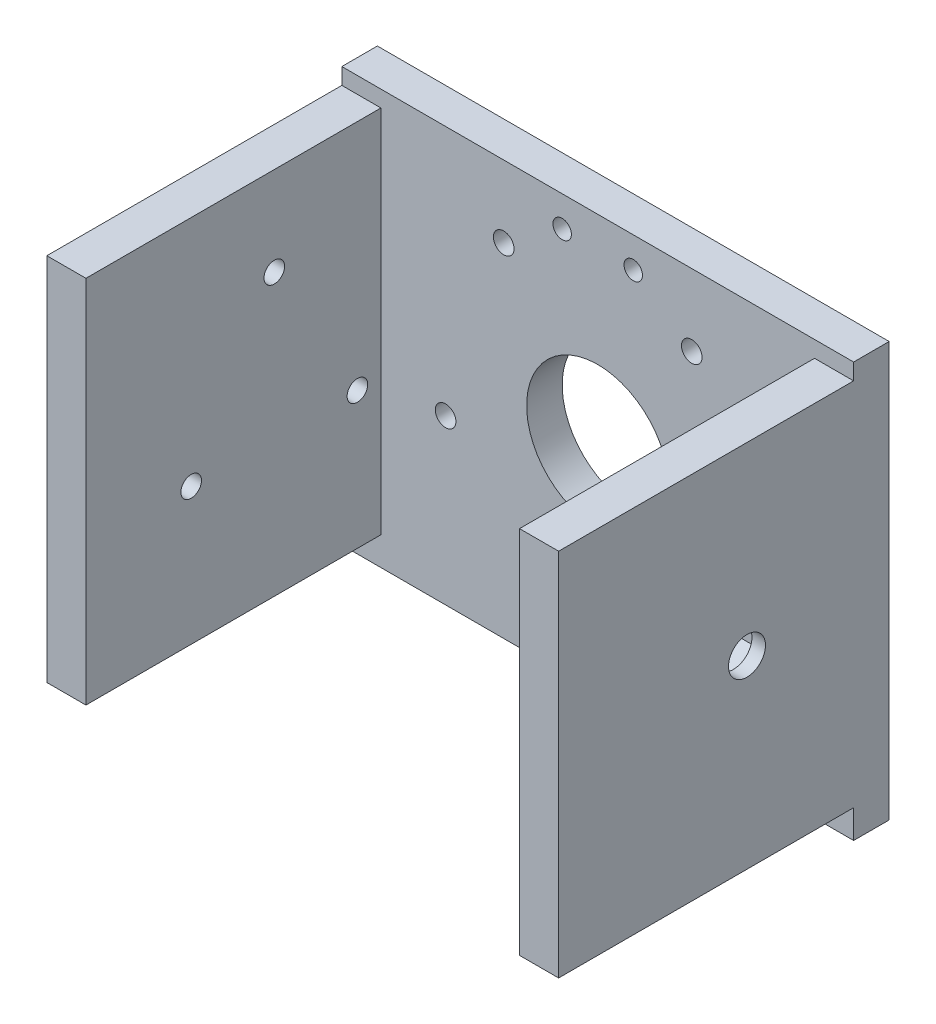
ISO-10303-21;
HEADER;
FILE_DESCRIPTION(('STEP AP214'),'2;1');
FILE_NAME('part.step','',(''),(''),'','','');
FILE_SCHEMA(('AUTOMOTIVE_DESIGN { 1 0 10303 214 1 1 1 1 }'));
ENDSEC;
DATA;
#1=APPLICATION_CONTEXT('core data for automotive mechanical design processes');
#2=APPLICATION_PROTOCOL_DEFINITION('international standard','automotive_design',2000,#1);
#3=PRODUCT_CONTEXT('',#1,'mechanical');
#4=PRODUCT('Part','Part','',(#3));
#5=PRODUCT_RELATED_PRODUCT_CATEGORY('part','',(#4));
#6=PRODUCT_DEFINITION_FORMATION('','',#4);
#7=PRODUCT_DEFINITION_CONTEXT('part definition',#1,'design');
#8=PRODUCT_DEFINITION('design','',#6,#7);
#9=PRODUCT_DEFINITION_SHAPE('','',#8);
#10=(LENGTH_UNIT() NAMED_UNIT(*) SI_UNIT(.MILLI.,.METRE.));
#11=(NAMED_UNIT(*) PLANE_ANGLE_UNIT() SI_UNIT($,.RADIAN.));
#12=(NAMED_UNIT(*) SI_UNIT($,.STERADIAN.) SOLID_ANGLE_UNIT());
#13=UNCERTAINTY_MEASURE_WITH_UNIT(LENGTH_MEASURE(1.E-05),#10,'distance_accuracy_value','');
#14=(GEOMETRIC_REPRESENTATION_CONTEXT(3) GLOBAL_UNCERTAINTY_ASSIGNED_CONTEXT((#13)) GLOBAL_UNIT_ASSIGNED_CONTEXT((#10,
#11,#12)) REPRESENTATION_CONTEXT('',''));
#15=CARTESIAN_POINT('',(0.,0.,0.));
#16=DIRECTION('',(0.,0.,1.));
#17=DIRECTION('',(1.,0.,0.));
#18=AXIS2_PLACEMENT_3D('',#15,#16,#17);
#19=CARTESIAN_POINT('',(330.5,0.,0.));
#20=DIRECTION('',(-1.,0.,0.));
#21=DIRECTION('',(0.,0.,1.));
#22=AXIS2_PLACEMENT_3D('',#19,#20,#21);
#23=PLANE('',#22);
#24=DIRECTION('',(0.,0.,1.));
#25=VECTOR('',#24,1.);
#26=CARTESIAN_POINT('',(330.5,326.,326.5));
#27=LINE('',#26,#25);
#28=CARTESIAN_POINT('',(330.5,326.,285.));
#29=VERTEX_POINT('',#28);
#30=CARTESIAN_POINT('',(330.5,326.,326.5));
#31=VERTEX_POINT('',#30);
#32=EDGE_CURVE('E197',#29,#31,#27,.T.);
#33=ORIENTED_EDGE('',*,*,#32,.F.);
#34=DIRECTION('',(0.,-1.,0.));
#35=VECTOR('',#34,1.);
#36=CARTESIAN_POINT('',(330.5,0.,285.));
#37=LINE('',#36,#35);
#38=CARTESIAN_POINT('',(330.5,274.,285.));
#39=VERTEX_POINT('',#38);
#40=EDGE_CURVE('E220',#29,#39,#37,.T.);
#41=ORIENTED_EDGE('',*,*,#40,.T.);
#42=DIRECTION('',(0.,0.,-1.));
#43=VECTOR('',#42,1.);
#44=CARTESIAN_POINT('',(330.5,274.,280.));
#45=LINE('',#44,#43);
#46=CARTESIAN_POINT('',(330.5,274.,326.5));
#47=VERTEX_POINT('',#46);
#48=EDGE_CURVE('E63',#47,#39,#45,.T.);
#49=ORIENTED_EDGE('',*,*,#48,.F.);
#50=DIRECTION('',(0.,-1.,0.));
#51=VECTOR('',#50,1.);
#52=CARTESIAN_POINT('',(330.5,274.,326.5));
#53=LINE('',#52,#51);
#54=EDGE_CURVE('E207',#31,#47,#53,.T.);
#55=ORIENTED_EDGE('',*,*,#54,.F.);
#56=EDGE_LOOP('',(#33,#41,#49,#55));
#57=FACE_BOUND('',#56,.T.);
#58=DIRECTION('',(0.,-0.499999999999993,0.866025403784443));
#59=VECTOR('',#58,1.);
#60=CARTESIAN_POINT('',(330.5,302.367136103677,304.1));
#61=LINE('',#60,#59);
#62=CARTESIAN_POINT('',(330.5,304.734272207355,300.));
#63=VERTEX_POINT('',#62);
#64=CARTESIAN_POINT('',(330.5,302.367136103678,304.1));
#65=VERTEX_POINT('',#64);
#66=EDGE_CURVE('E182',#63,#65,#61,.T.);
#67=ORIENTED_EDGE('',*,*,#66,.T.);
#68=DIRECTION('',(0.,-1.,0.));
#69=VECTOR('',#68,1.);
#70=CARTESIAN_POINT('',(330.5,297.632863896323,304.1));
#71=LINE('',#70,#69);
#72=CARTESIAN_POINT('',(330.5,297.632863896323,304.1));
#73=VERTEX_POINT('',#72);
#74=EDGE_CURVE('E55',#65,#73,#71,.T.);
#75=ORIENTED_EDGE('',*,*,#74,.T.);
#76=DIRECTION('',(0.,-0.499999999999993,-0.866025403784443));
#77=VECTOR('',#76,1.);
#78=CARTESIAN_POINT('',(330.5,295.265727792645,300.));
#79=LINE('',#78,#77);
#80=CARTESIAN_POINT('',(330.5,295.265727792645,300.));
#81=VERTEX_POINT('',#80);
#82=EDGE_CURVE('E186',#73,#81,#79,.T.);
#83=ORIENTED_EDGE('',*,*,#82,.T.);
#84=DIRECTION('',(0.,0.499999999999998,-0.86602540378444));
#85=VECTOR('',#84,1.);
#86=CARTESIAN_POINT('',(330.5,297.632863896323,295.9));
#87=LINE('',#86,#85);
#88=CARTESIAN_POINT('',(330.5,297.632863896323,295.9));
#89=VERTEX_POINT('',#88);
#90=EDGE_CURVE('E643',#81,#89,#87,.T.);
#91=ORIENTED_EDGE('',*,*,#90,.T.);
#92=DIRECTION('',(0.,1.,0.));
#93=VECTOR('',#92,1.);
#94=CARTESIAN_POINT('',(330.5,302.367136103677,295.9));
#95=LINE('',#94,#93);
#96=CARTESIAN_POINT('',(330.5,302.367136103677,295.9));
#97=VERTEX_POINT('',#96);
#98=EDGE_CURVE('E640',#89,#97,#95,.T.);
#99=ORIENTED_EDGE('',*,*,#98,.T.);
#100=DIRECTION('',(0.,0.499999999999998,0.86602540378444));
#101=VECTOR('',#100,1.);
#102=CARTESIAN_POINT('',(330.5,304.734272207355,300.));
#103=LINE('',#102,#101);
#104=EDGE_CURVE('E634',#97,#63,#103,.T.);
#105=ORIENTED_EDGE('',*,*,#104,.T.);
#106=EDGE_LOOP('',(#67,#75,#83,#91,#99,#105));
#107=FACE_BOUND('',#106,.T.);
#108=ADVANCED_FACE('F39',(#57,#107),#23,.T.);
#109=CARTESIAN_POINT('',(336.,300.,300.));
#110=DIRECTION('',(-1.,0.,0.));
#111=DIRECTION('',(0.,0.,1.));
#112=AXIS2_PLACEMENT_3D('',#109,#110,#111);
#113=CYLINDRICAL_SURFACE('',#112,2.59999999999999);
#114=CARTESIAN_POINT('',(336.,300.,300.));
#115=DIRECTION('',(1.,0.,0.));
#116=DIRECTION('',(0.,0.,-1.));
#117=AXIS2_PLACEMENT_3D('',#114,#115,#116);
#118=CIRCLE('',#117,2.59999999999999);
#119=CARTESIAN_POINT('',(336.,300.,297.4));
#120=VERTEX_POINT('',#119);
#121=EDGE_CURVE('E190',#120,#120,#118,.T.);
#122=ORIENTED_EDGE('',*,*,#121,.T.);
#123=EDGE_LOOP('',(#122));
#124=FACE_BOUND('',#123,.T.);
#125=CARTESIAN_POINT('',(334.1,300.,300.));
#126=DIRECTION('',(-1.,0.,0.));
#127=DIRECTION('',(0.,0.,1.));
#128=AXIS2_PLACEMENT_3D('',#125,#126,#127);
#129=CIRCLE('',#128,2.59999999999999);
#130=CARTESIAN_POINT('',(334.1,300.,302.6));
#131=VERTEX_POINT('',#130);
#132=EDGE_CURVE('E43',#131,#131,#129,.T.);
#133=ORIENTED_EDGE('',*,*,#132,.T.);
#134=EDGE_LOOP('',(#133));
#135=FACE_BOUND('',#134,.T.);
#136=ADVANCED_FACE('F416',(#124,#135),#113,.F.);
#137=CARTESIAN_POINT('',(0.,0.,285.));
#138=DIRECTION('',(0.,0.,1.));
#139=DIRECTION('',(1.,0.,0.));
#140=AXIS2_PLACEMENT_3D('',#137,#138,#139);
#141=PLANE('',#140);
#142=CARTESIAN_POINT('',(295.,324.,285.));
#143=DIRECTION('',(0.,0.,1.));
#144=DIRECTION('',(1.,0.,0.));
#145=AXIS2_PLACEMENT_3D('',#142,#143,#144);
#146=CIRCLE('',#145,1.30000000000002);
#147=CARTESIAN_POINT('',(296.3,324.,285.));
#148=VERTEX_POINT('',#147);
#149=EDGE_CURVE('E281',#148,#148,#146,.T.);
#150=ORIENTED_EDGE('',*,*,#149,.F.);
#151=EDGE_LOOP('',(#150));
#152=FACE_BOUND('',#151,.T.);
#153=CARTESIAN_POINT('',(321.398771616641,293.047117626564,285.));
#154=DIRECTION('',(0.,0.,1.));
#155=DIRECTION('',(1.,0.,0.));
#156=AXIS2_PLACEMENT_3D('',#153,#154,#155);
#157=CIRCLE('',#156,1.45000000000001);
#158=CARTESIAN_POINT('',(322.848771616641,293.047117626564,285.));
#159=VERTEX_POINT('',#158);
#160=EDGE_CURVE('E293',#159,#159,#157,.T.);
#161=ORIENTED_EDGE('',*,*,#160,.F.);
#162=EDGE_LOOP('',(#161));
#163=FACE_BOUND('',#162,.T.);
#164=CARTESIAN_POINT('',(278.601228383359,293.047117626564,285.));
#165=DIRECTION('',(0.,0.,1.));
#166=DIRECTION('',(1.,0.,0.));
#167=AXIS2_PLACEMENT_3D('',#164,#165,#166);
#168=CIRCLE('',#167,1.45000000000001);
#169=CARTESIAN_POINT('',(280.051228383359,293.047117626564,285.));
#170=VERTEX_POINT('',#169);
#171=EDGE_CURVE('E305',#170,#170,#168,.T.);
#172=ORIENTED_EDGE('',*,*,#171,.F.);
#173=EDGE_LOOP('',(#172));
#174=FACE_BOUND('',#173,.T.);
#175=CARTESIAN_POINT('',(300.,300.,285.));
#176=DIRECTION('',(0.,0.,1.));
#177=DIRECTION('',(1.,0.,0.));
#178=AXIS2_PLACEMENT_3D('',#175,#176,#177);
#179=CIRCLE('',#178,10.);
#180=CARTESIAN_POINT('',(310.,300.,285.));
#181=VERTEX_POINT('',#180);
#182=EDGE_CURVE('E317',#181,#181,#179,.T.);
#183=ORIENTED_EDGE('',*,*,#182,.F.);
#184=EDGE_LOOP('',(#183));
#185=FACE_BOUND('',#184,.T.);
#186=CARTESIAN_POINT('',(286.774831823419,318.202882373436,285.));
#187=DIRECTION('',(0.,0.,1.));
#188=DIRECTION('',(1.,0.,0.));
#189=AXIS2_PLACEMENT_3D('',#186,#187,#188);
#190=CIRCLE('',#189,1.45000000000001);
#191=CARTESIAN_POINT('',(288.224831823419,318.202882373436,285.));
#192=VERTEX_POINT('',#191);
#193=EDGE_CURVE('E311',#192,#192,#190,.T.);
#194=ORIENTED_EDGE('',*,*,#193,.F.);
#195=EDGE_LOOP('',(#194));
#196=FACE_BOUND('',#195,.T.);
#197=CARTESIAN_POINT('',(300.,277.5,285.));
#198=DIRECTION('',(0.,0.,1.));
#199=DIRECTION('',(1.,0.,0.));
#200=AXIS2_PLACEMENT_3D('',#197,#198,#199);
#201=CIRCLE('',#200,1.45000000000001);
#202=CARTESIAN_POINT('',(301.45,277.5,285.));
#203=VERTEX_POINT('',#202);
#204=EDGE_CURVE('E299',#203,#203,#201,.T.);
#205=ORIENTED_EDGE('',*,*,#204,.F.);
#206=EDGE_LOOP('',(#205));
#207=FACE_BOUND('',#206,.T.);
#208=CARTESIAN_POINT('',(313.225168176581,318.202882373436,285.));
#209=DIRECTION('',(0.,0.,1.));
#210=DIRECTION('',(1.,0.,0.));
#211=AXIS2_PLACEMENT_3D('',#208,#209,#210);
#212=CIRCLE('',#211,1.45000000000001);
#213=CARTESIAN_POINT('',(314.675168176581,318.202882373436,285.));
#214=VERTEX_POINT('',#213);
#215=EDGE_CURVE('E287',#214,#214,#212,.T.);
#216=ORIENTED_EDGE('',*,*,#215,.F.);
#217=EDGE_LOOP('',(#216));
#218=FACE_BOUND('',#217,.T.);
#219=CARTESIAN_POINT('',(305.,324.,285.));
#220=DIRECTION('',(0.,0.,1.));
#221=DIRECTION('',(1.,0.,0.));
#222=AXIS2_PLACEMENT_3D('',#219,#220,#221);
#223=CIRCLE('',#222,1.30000000000002);
#224=CARTESIAN_POINT('',(306.3,324.,285.));
#225=VERTEX_POINT('',#224);
#226=EDGE_CURVE('E275',#225,#225,#223,.T.);
#227=ORIENTED_EDGE('',*,*,#226,.F.);
#228=EDGE_LOOP('',(#227));
#229=FACE_BOUND('',#228,.T.);
#230=ORIENTED_EDGE('',*,*,#40,.F.);
#231=DIRECTION('',(1.,0.,0.));
#232=VECTOR('',#231,1.);
#233=CARTESIAN_POINT('',(0.,326.,285.));
#234=LINE('',#233,#232);
#235=CARTESIAN_POINT('',(336.,326.,285.));
#236=VERTEX_POINT('',#235);
#237=EDGE_CURVE('E217',#29,#236,#234,.T.);
#238=ORIENTED_EDGE('',*,*,#237,.T.);
#239=DIRECTION('',(0.,1.,0.));
#240=VECTOR('',#239,1.);
#241=CARTESIAN_POINT('',(336.,270.,285.));
#242=LINE('',#241,#240);
#243=CARTESIAN_POINT('',(336.,328.3,285.));
#244=VERTEX_POINT('',#243);
#245=EDGE_CURVE('E329',#236,#244,#242,.T.);
#246=ORIENTED_EDGE('',*,*,#245,.T.);
#247=DIRECTION('',(-1.,0.,0.));
#248=VECTOR('',#247,1.);
#249=CARTESIAN_POINT('',(336.,328.3,285.));
#250=LINE('',#249,#248);
#251=CARTESIAN_POINT('',(264.,328.3,285.));
#252=VERTEX_POINT('',#251);
#253=EDGE_CURVE('E333',#244,#252,#250,.T.);
#254=ORIENTED_EDGE('',*,*,#253,.T.);
#255=DIRECTION('',(0.,-1.,0.));
#256=VECTOR('',#255,1.);
#257=CARTESIAN_POINT('',(264.,328.3,285.));
#258=LINE('',#257,#256);
#259=CARTESIAN_POINT('',(264.,326.,285.));
#260=VERTEX_POINT('',#259);
#261=EDGE_CURVE('E323',#252,#260,#258,.T.);
#262=ORIENTED_EDGE('',*,*,#261,.T.);
#263=DIRECTION('',(1.,0.,0.));
#264=VECTOR('',#263,1.);
#265=CARTESIAN_POINT('',(0.,326.,285.));
#266=LINE('',#265,#264);
#267=CARTESIAN_POINT('',(269.5,326.,285.));
#268=VERTEX_POINT('',#267);
#269=EDGE_CURVE('E268',#260,#268,#266,.T.);
#270=ORIENTED_EDGE('',*,*,#269,.T.);
#271=DIRECTION('',(0.,-1.,0.));
#272=VECTOR('',#271,1.);
#273=CARTESIAN_POINT('',(269.5,0.,285.));
#274=LINE('',#273,#272);
#275=CARTESIAN_POINT('',(269.5,274.,285.));
#276=VERTEX_POINT('',#275);
#277=EDGE_CURVE('E271',#268,#276,#274,.T.);
#278=ORIENTED_EDGE('',*,*,#277,.T.);
#279=DIRECTION('',(-1.,0.,0.));
#280=VECTOR('',#279,1.);
#281=CARTESIAN_POINT('',(0.,274.,285.));
#282=LINE('',#281,#280);
#283=CARTESIAN_POINT('',(264.,274.,285.));
#284=VERTEX_POINT('',#283);
#285=EDGE_CURVE('E265',#276,#284,#282,.T.);
#286=ORIENTED_EDGE('',*,*,#285,.T.);
#287=CARTESIAN_POINT('',(264.,270.,285.));
#288=VERTEX_POINT('',#287);
#289=EDGE_CURVE('E327',#284,#288,#258,.T.);
#290=ORIENTED_EDGE('',*,*,#289,.T.);
#291=DIRECTION('',(1.,0.,0.));
#292=VECTOR('',#291,1.);
#293=CARTESIAN_POINT('',(264.,270.,285.));
#294=LINE('',#293,#292);
#295=CARTESIAN_POINT('',(336.,270.,285.));
#296=VERTEX_POINT('',#295);
#297=EDGE_CURVE('E326',#288,#296,#294,.T.);
#298=ORIENTED_EDGE('',*,*,#297,.T.);
#299=CARTESIAN_POINT('',(336.,274.,285.));
#300=VERTEX_POINT('',#299);
#301=EDGE_CURVE('E330',#296,#300,#242,.T.);
#302=ORIENTED_EDGE('',*,*,#301,.T.);
#303=DIRECTION('',(-1.,0.,0.));
#304=VECTOR('',#303,1.);
#305=CARTESIAN_POINT('',(0.,274.,285.));
#306=LINE('',#305,#304);
#307=EDGE_CURVE('E214',#300,#39,#306,.T.);
#308=ORIENTED_EDGE('',*,*,#307,.T.);
#309=EDGE_LOOP('',(#230,#238,#246,#254,#262,#270,#278,#286,#290,#298,#302,#308));
#310=FACE_BOUND('',#309,.T.);
#311=ADVANCED_FACE('F377',(#152,#163,#174,#185,#196,#207,#218,#229,#310),#141,.T.);
#312=CARTESIAN_POINT('',(0.,0.,280.));
#313=DIRECTION('',(0.,0.,1.));
#314=DIRECTION('',(1.,0.,0.));
#315=AXIS2_PLACEMENT_3D('',#312,#313,#314);
#316=PLANE('',#315);
#317=DIRECTION('',(-1.,0.,0.));
#318=VECTOR('',#317,1.);
#319=CARTESIAN_POINT('',(336.,328.3,280.));
#320=LINE('',#319,#318);
#321=CARTESIAN_POINT('',(336.,328.3,280.));
#322=VERTEX_POINT('',#321);
#323=CARTESIAN_POINT('',(264.,328.3,280.));
#324=VERTEX_POINT('',#323);
#325=EDGE_CURVE('E341',#322,#324,#320,.T.);
#326=ORIENTED_EDGE('',*,*,#325,.F.);
#327=DIRECTION('',(0.,1.,0.));
#328=VECTOR('',#327,1.);
#329=CARTESIAN_POINT('',(336.,270.,280.));
#330=LINE('',#329,#328);
#331=CARTESIAN_POINT('',(336.,270.,280.));
#332=VERTEX_POINT('',#331);
#333=EDGE_CURVE('E339',#332,#322,#330,.T.);
#334=ORIENTED_EDGE('',*,*,#333,.F.);
#335=DIRECTION('',(1.,0.,0.));
#336=VECTOR('',#335,1.);
#337=CARTESIAN_POINT('',(264.,270.,280.));
#338=LINE('',#337,#336);
#339=CARTESIAN_POINT('',(264.,270.,280.));
#340=VERTEX_POINT('',#339);
#341=EDGE_CURVE('E337',#340,#332,#338,.T.);
#342=ORIENTED_EDGE('',*,*,#341,.F.);
#343=DIRECTION('',(0.,-1.,0.));
#344=VECTOR('',#343,1.);
#345=CARTESIAN_POINT('',(264.,328.3,280.));
#346=LINE('',#345,#344);
#347=EDGE_CURVE('E320',#324,#340,#346,.T.);
#348=ORIENTED_EDGE('',*,*,#347,.F.);
#349=EDGE_LOOP('',(#326,#334,#342,#348));
#350=FACE_BOUND('',#349,.T.);
#351=CARTESIAN_POINT('',(300.,300.,280.));
#352=DIRECTION('',(0.,0.,1.));
#353=DIRECTION('',(1.,0.,0.));
#354=AXIS2_PLACEMENT_3D('',#351,#352,#353);
#355=CIRCLE('',#354,10.);
#356=CARTESIAN_POINT('',(310.,300.,280.));
#357=VERTEX_POINT('',#356);
#358=EDGE_CURVE('E314',#357,#357,#355,.T.);
#359=ORIENTED_EDGE('',*,*,#358,.T.);
#360=EDGE_LOOP('',(#359));
#361=FACE_BOUND('',#360,.T.);
#362=CARTESIAN_POINT('',(286.774831823419,318.202882373436,280.));
#363=DIRECTION('',(0.,0.,1.));
#364=DIRECTION('',(1.,0.,0.));
#365=AXIS2_PLACEMENT_3D('',#362,#363,#364);
#366=CIRCLE('',#365,1.45000000000001);
#367=CARTESIAN_POINT('',(288.224831823419,318.202882373436,280.));
#368=VERTEX_POINT('',#367);
#369=EDGE_CURVE('E308',#368,#368,#366,.T.);
#370=ORIENTED_EDGE('',*,*,#369,.T.);
#371=EDGE_LOOP('',(#370));
#372=FACE_BOUND('',#371,.T.);
#373=CARTESIAN_POINT('',(278.601228383359,293.047117626564,280.));
#374=DIRECTION('',(0.,0.,1.));
#375=DIRECTION('',(1.,0.,0.));
#376=AXIS2_PLACEMENT_3D('',#373,#374,#375);
#377=CIRCLE('',#376,1.45000000000001);
#378=CARTESIAN_POINT('',(280.051228383359,293.047117626564,280.));
#379=VERTEX_POINT('',#378);
#380=EDGE_CURVE('E302',#379,#379,#377,.T.);
#381=ORIENTED_EDGE('',*,*,#380,.T.);
#382=EDGE_LOOP('',(#381));
#383=FACE_BOUND('',#382,.T.);
#384=CARTESIAN_POINT('',(300.,277.5,280.));
#385=DIRECTION('',(0.,0.,1.));
#386=DIRECTION('',(1.,0.,0.));
#387=AXIS2_PLACEMENT_3D('',#384,#385,#386);
#388=CIRCLE('',#387,1.45000000000001);
#389=CARTESIAN_POINT('',(301.45,277.5,280.));
#390=VERTEX_POINT('',#389);
#391=EDGE_CURVE('E296',#390,#390,#388,.T.);
#392=ORIENTED_EDGE('',*,*,#391,.T.);
#393=EDGE_LOOP('',(#392));
#394=FACE_BOUND('',#393,.T.);
#395=CARTESIAN_POINT('',(321.398771616641,293.047117626564,280.));
#396=DIRECTION('',(0.,0.,1.));
#397=DIRECTION('',(1.,0.,0.));
#398=AXIS2_PLACEMENT_3D('',#395,#396,#397);
#399=CIRCLE('',#398,1.45000000000001);
#400=CARTESIAN_POINT('',(322.848771616641,293.047117626564,280.));
#401=VERTEX_POINT('',#400);
#402=EDGE_CURVE('E290',#401,#401,#399,.T.);
#403=ORIENTED_EDGE('',*,*,#402,.T.);
#404=EDGE_LOOP('',(#403));
#405=FACE_BOUND('',#404,.T.);
#406=CARTESIAN_POINT('',(313.225168176581,318.202882373436,280.));
#407=DIRECTION('',(0.,0.,1.));
#408=DIRECTION('',(1.,0.,0.));
#409=AXIS2_PLACEMENT_3D('',#406,#407,#408);
#410=CIRCLE('',#409,1.45000000000001);
#411=CARTESIAN_POINT('',(314.675168176581,318.202882373436,280.));
#412=VERTEX_POINT('',#411);
#413=EDGE_CURVE('E284',#412,#412,#410,.T.);
#414=ORIENTED_EDGE('',*,*,#413,.T.);
#415=EDGE_LOOP('',(#414));
#416=FACE_BOUND('',#415,.T.);
#417=CARTESIAN_POINT('',(295.,324.,280.));
#418=DIRECTION('',(0.,0.,1.));
#419=DIRECTION('',(1.,0.,0.));
#420=AXIS2_PLACEMENT_3D('',#417,#418,#419);
#421=CIRCLE('',#420,1.30000000000002);
#422=CARTESIAN_POINT('',(296.3,324.,280.));
#423=VERTEX_POINT('',#422);
#424=EDGE_CURVE('E278',#423,#423,#421,.T.);
#425=ORIENTED_EDGE('',*,*,#424,.T.);
#426=EDGE_LOOP('',(#425));
#427=FACE_BOUND('',#426,.T.);
#428=CARTESIAN_POINT('',(305.,324.,280.));
#429=DIRECTION('',(0.,0.,1.));
#430=DIRECTION('',(1.,0.,0.));
#431=AXIS2_PLACEMENT_3D('',#428,#429,#430);
#432=CIRCLE('',#431,1.30000000000002);
#433=CARTESIAN_POINT('',(306.3,324.,280.));
#434=VERTEX_POINT('',#433);
#435=EDGE_CURVE('E274',#434,#434,#432,.T.);
#436=ORIENTED_EDGE('',*,*,#435,.T.);
#437=EDGE_LOOP('',(#436));
#438=FACE_BOUND('',#437,.T.);
#439=ADVANCED_FACE('F361',(#350,#361,#372,#383,#394,#405,#416,#427,#438),#316,.F.);
#440=CARTESIAN_POINT('',(264.,328.3,285.));
#441=DIRECTION('',(1.,0.,0.));
#442=DIRECTION('',(0.,0.,-1.));
#443=AXIS2_PLACEMENT_3D('',#440,#441,#442);
#444=PLANE('',#443);
#445=CARTESIAN_POINT('',(264.,300.,300.));
#446=DIRECTION('',(1.,0.,0.));
#447=DIRECTION('',(0.,0.,-1.));
#448=AXIS2_PLACEMENT_3D('',#445,#446,#447);
#449=CIRCLE('',#448,7.6);
#450=CARTESIAN_POINT('',(264.,300.,292.4));
#451=VERTEX_POINT('',#450);
#452=EDGE_CURVE('E222',#451,#451,#449,.T.);
#453=ORIENTED_EDGE('',*,*,#452,.T.);
#454=EDGE_LOOP('',(#453));
#455=FACE_BOUND('',#454,.T.);
#456=ORIENTED_EDGE('',*,*,#289,.F.);
#457=DIRECTION('',(0.,0.,-1.));
#458=VECTOR('',#457,1.);
#459=CARTESIAN_POINT('',(264.,274.,280.));
#460=LINE('',#459,#458);
#461=CARTESIAN_POINT('',(264.,274.,326.5));
#462=VERTEX_POINT('',#461);
#463=EDGE_CURVE('E250',#462,#284,#460,.T.);
#464=ORIENTED_EDGE('',*,*,#463,.F.);
#465=DIRECTION('',(0.,-1.,0.));
#466=VECTOR('',#465,1.);
#467=CARTESIAN_POINT('',(264.,274.,326.5));
#468=LINE('',#467,#466);
#469=CARTESIAN_POINT('',(264.,326.,326.5));
#470=VERTEX_POINT('',#469);
#471=EDGE_CURVE('E257',#470,#462,#468,.T.);
#472=ORIENTED_EDGE('',*,*,#471,.F.);
#473=DIRECTION('',(0.,0.,1.));
#474=VECTOR('',#473,1.);
#475=CARTESIAN_POINT('',(264.,326.,326.5));
#476=LINE('',#475,#474);
#477=EDGE_CURVE('E244',#260,#470,#476,.T.);
#478=ORIENTED_EDGE('',*,*,#477,.F.);
#479=ORIENTED_EDGE('',*,*,#261,.F.);
#480=DIRECTION('',(0.,0.,-1.));
#481=VECTOR('',#480,1.);
#482=CARTESIAN_POINT('',(264.,328.3,285.));
#483=LINE('',#482,#481);
#484=EDGE_CURVE('E335',#252,#324,#483,.T.);
#485=ORIENTED_EDGE('',*,*,#484,.T.);
#486=ORIENTED_EDGE('',*,*,#347,.T.);
#487=DIRECTION('',(0.,0.,-1.));
#488=VECTOR('',#487,1.);
#489=CARTESIAN_POINT('',(264.,270.,285.));
#490=LINE('',#489,#488);
#491=EDGE_CURVE('E11',#288,#340,#490,.T.);
#492=ORIENTED_EDGE('',*,*,#491,.F.);
#493=EDGE_LOOP('',(#456,#464,#472,#478,#479,#485,#486,#492));
#494=FACE_BOUND('',#493,.T.);
#495=CARTESIAN_POINT('',(264.,293.25,288.30865704891));
#496=DIRECTION('',(1.,0.,0.));
#497=DIRECTION('',(0.,0.,-1.));
#498=AXIS2_PLACEMENT_3D('',#495,#496,#497);
#499=CIRCLE('',#498,1.45000000000001);
#500=CARTESIAN_POINT('',(264.,293.25,286.85865704891));
#501=VERTEX_POINT('',#500);
#502=EDGE_CURVE('E232',#501,#501,#499,.T.);
#503=ORIENTED_EDGE('',*,*,#502,.T.);
#504=EDGE_LOOP('',(#503));
#505=FACE_BOUND('',#504,.T.);
#506=CARTESIAN_POINT('',(264.,313.5,300.));
#507=DIRECTION('',(1.,0.,0.));
#508=DIRECTION('',(0.,0.,-1.));
#509=AXIS2_PLACEMENT_3D('',#506,#507,#508);
#510=CIRCLE('',#509,1.45000000000001);
#511=CARTESIAN_POINT('',(264.,313.5,298.55));
#512=VERTEX_POINT('',#511);
#513=EDGE_CURVE('E238',#512,#512,#510,.T.);
#514=ORIENTED_EDGE('',*,*,#513,.T.);
#515=EDGE_LOOP('',(#514));
#516=FACE_BOUND('',#515,.T.);
#517=CARTESIAN_POINT('',(264.,293.25,311.69134295109));
#518=DIRECTION('',(1.,0.,0.));
#519=DIRECTION('',(0.,0.,-1.));
#520=AXIS2_PLACEMENT_3D('',#517,#518,#519);
#521=CIRCLE('',#520,1.45000000000001);
#522=CARTESIAN_POINT('',(264.,293.25,310.24134295109));
#523=VERTEX_POINT('',#522);
#524=EDGE_CURVE('E226',#523,#523,#521,.T.);
#525=ORIENTED_EDGE('',*,*,#524,.T.);
#526=EDGE_LOOP('',(#525));
#527=FACE_BOUND('',#526,.T.);
#528=ADVANCED_FACE('F41',(#455,#494,#505,#516,#527),#444,.F.);
#529=CARTESIAN_POINT('',(264.,270.,285.));
#530=DIRECTION('',(0.,1.,0.));
#531=DIRECTION('',(0.,0.,1.));
#532=AXIS2_PLACEMENT_3D('',#529,#530,#531);
#533=PLANE('',#532);
#534=ORIENTED_EDGE('',*,*,#341,.T.);
#535=DIRECTION('',(0.,0.,-1.));
#536=VECTOR('',#535,1.);
#537=CARTESIAN_POINT('',(336.,270.,285.));
#538=LINE('',#537,#536);
#539=EDGE_CURVE('E48',#296,#332,#538,.T.);
#540=ORIENTED_EDGE('',*,*,#539,.F.);
#541=ORIENTED_EDGE('',*,*,#297,.F.);
#542=ORIENTED_EDGE('',*,*,#491,.T.);
#543=EDGE_LOOP('',(#534,#540,#541,#542));
#544=FACE_BOUND('',#543,.T.);
#545=ADVANCED_FACE('F390',(#544),#533,.F.);
#546=CARTESIAN_POINT('',(336.,270.,285.));
#547=DIRECTION('',(-1.,0.,0.));
#548=DIRECTION('',(0.,0.,1.));
#549=AXIS2_PLACEMENT_3D('',#546,#547,#548);
#550=PLANE('',#549);
#551=ORIENTED_EDGE('',*,*,#333,.T.);
#552=DIRECTION('',(0.,0.,-1.));
#553=VECTOR('',#552,1.);
#554=CARTESIAN_POINT('',(336.,328.3,285.));
#555=LINE('',#554,#553);
#556=EDGE_CURVE('E345',#244,#322,#555,.T.);
#557=ORIENTED_EDGE('',*,*,#556,.F.);
#558=ORIENTED_EDGE('',*,*,#245,.F.);
#559=DIRECTION('',(0.,0.,1.));
#560=VECTOR('',#559,1.);
#561=CARTESIAN_POINT('',(336.,326.,326.5));
#562=LINE('',#561,#560);
#563=CARTESIAN_POINT('',(336.,326.,326.5));
#564=VERTEX_POINT('',#563);
#565=EDGE_CURVE('E198',#236,#564,#562,.T.);
#566=ORIENTED_EDGE('',*,*,#565,.T.);
#567=DIRECTION('',(0.,-1.,0.));
#568=VECTOR('',#567,1.);
#569=CARTESIAN_POINT('',(336.,274.,326.5));
#570=LINE('',#569,#568);
#571=CARTESIAN_POINT('',(336.,274.,326.5));
#572=VERTEX_POINT('',#571);
#573=EDGE_CURVE('E200',#564,#572,#570,.T.);
#574=ORIENTED_EDGE('',*,*,#573,.T.);
#575=DIRECTION('',(0.,0.,-1.));
#576=VECTOR('',#575,1.);
#577=CARTESIAN_POINT('',(336.,274.,280.));
#578=LINE('',#577,#576);
#579=EDGE_CURVE('E202',#572,#300,#578,.T.);
#580=ORIENTED_EDGE('',*,*,#579,.T.);
#581=ORIENTED_EDGE('',*,*,#301,.F.);
#582=ORIENTED_EDGE('',*,*,#539,.T.);
#583=EDGE_LOOP('',(#551,#557,#558,#566,#574,#580,#581,#582));
#584=FACE_BOUND('',#583,.T.);
#585=ORIENTED_EDGE('',*,*,#121,.F.);
#586=EDGE_LOOP('',(#585));
#587=FACE_BOUND('',#586,.T.);
#588=ADVANCED_FACE('F353',(#584,#587),#550,.F.);
#589=CARTESIAN_POINT('',(336.,328.3,285.));
#590=DIRECTION('',(0.,-1.,0.));
#591=DIRECTION('',(0.,0.,-1.));
#592=AXIS2_PLACEMENT_3D('',#589,#590,#591);
#593=PLANE('',#592);
#594=ORIENTED_EDGE('',*,*,#325,.T.);
#595=ORIENTED_EDGE('',*,*,#484,.F.);
#596=ORIENTED_EDGE('',*,*,#253,.F.);
#597=ORIENTED_EDGE('',*,*,#556,.T.);
#598=EDGE_LOOP('',(#594,#595,#596,#597));
#599=FACE_BOUND('',#598,.T.);
#600=ADVANCED_FACE('F366',(#599),#593,.F.);
#601=CARTESIAN_POINT('',(300.,300.,285.));
#602=DIRECTION('',(0.,0.,-1.));
#603=DIRECTION('',(-1.,0.,0.));
#604=AXIS2_PLACEMENT_3D('',#601,#602,#603);
#605=CYLINDRICAL_SURFACE('',#604,10.);
#606=ORIENTED_EDGE('',*,*,#182,.T.);
#607=EDGE_LOOP('',(#606));
#608=FACE_BOUND('',#607,.T.);
#609=ORIENTED_EDGE('',*,*,#358,.F.);
#610=EDGE_LOOP('',(#609));
#611=FACE_BOUND('',#610,.T.);
#612=ADVANCED_FACE('F486',(#608,#611),#605,.F.);
#613=CARTESIAN_POINT('',(286.774831823419,318.202882373436,285.));
#614=DIRECTION('',(0.,0.,-1.));
#615=DIRECTION('',(-1.,0.,0.));
#616=AXIS2_PLACEMENT_3D('',#613,#614,#615);
#617=CYLINDRICAL_SURFACE('',#616,1.45000000000001);
#618=ORIENTED_EDGE('',*,*,#193,.T.);
#619=EDGE_LOOP('',(#618));
#620=FACE_BOUND('',#619,.T.);
#621=ORIENTED_EDGE('',*,*,#369,.F.);
#622=EDGE_LOOP('',(#621));
#623=FACE_BOUND('',#622,.T.);
#624=ADVANCED_FACE('F482',(#620,#623),#617,.F.);
#625=CARTESIAN_POINT('',(278.601228383359,293.047117626564,285.));
#626=DIRECTION('',(0.,0.,-1.));
#627=DIRECTION('',(-1.,0.,0.));
#628=AXIS2_PLACEMENT_3D('',#625,#626,#627);
#629=CYLINDRICAL_SURFACE('',#628,1.45000000000001);
#630=ORIENTED_EDGE('',*,*,#171,.T.);
#631=EDGE_LOOP('',(#630));
#632=FACE_BOUND('',#631,.T.);
#633=ORIENTED_EDGE('',*,*,#380,.F.);
#634=EDGE_LOOP('',(#633));
#635=FACE_BOUND('',#634,.T.);
#636=ADVANCED_FACE('F478',(#632,#635),#629,.F.);
#637=CARTESIAN_POINT('',(300.,277.5,285.));
#638=DIRECTION('',(0.,0.,-1.));
#639=DIRECTION('',(-1.,0.,0.));
#640=AXIS2_PLACEMENT_3D('',#637,#638,#639);
#641=CYLINDRICAL_SURFACE('',#640,1.45000000000001);
#642=ORIENTED_EDGE('',*,*,#204,.T.);
#643=EDGE_LOOP('',(#642));
#644=FACE_BOUND('',#643,.T.);
#645=ORIENTED_EDGE('',*,*,#391,.F.);
#646=EDGE_LOOP('',(#645));
#647=FACE_BOUND('',#646,.T.);
#648=ADVANCED_FACE('F474',(#644,#647),#641,.F.);
#649=CARTESIAN_POINT('',(321.398771616641,293.047117626564,285.));
#650=DIRECTION('',(0.,0.,-1.));
#651=DIRECTION('',(-1.,0.,0.));
#652=AXIS2_PLACEMENT_3D('',#649,#650,#651);
#653=CYLINDRICAL_SURFACE('',#652,1.45000000000001);
#654=ORIENTED_EDGE('',*,*,#160,.T.);
#655=EDGE_LOOP('',(#654));
#656=FACE_BOUND('',#655,.T.);
#657=ORIENTED_EDGE('',*,*,#402,.F.);
#658=EDGE_LOOP('',(#657));
#659=FACE_BOUND('',#658,.T.);
#660=ADVANCED_FACE('F470',(#656,#659),#653,.F.);
#661=CARTESIAN_POINT('',(313.225168176581,318.202882373436,285.));
#662=DIRECTION('',(0.,0.,-1.));
#663=DIRECTION('',(-1.,0.,0.));
#664=AXIS2_PLACEMENT_3D('',#661,#662,#663);
#665=CYLINDRICAL_SURFACE('',#664,1.45000000000001);
#666=ORIENTED_EDGE('',*,*,#215,.T.);
#667=EDGE_LOOP('',(#666));
#668=FACE_BOUND('',#667,.T.);
#669=ORIENTED_EDGE('',*,*,#413,.F.);
#670=EDGE_LOOP('',(#669));
#671=FACE_BOUND('',#670,.T.);
#672=ADVANCED_FACE('F463',(#668,#671),#665,.F.);
#673=CARTESIAN_POINT('',(295.,324.,285.));
#674=DIRECTION('',(0.,0.,-1.));
#675=DIRECTION('',(-1.,0.,0.));
#676=AXIS2_PLACEMENT_3D('',#673,#674,#675);
#677=CYLINDRICAL_SURFACE('',#676,1.30000000000002);
#678=ORIENTED_EDGE('',*,*,#149,.T.);
#679=EDGE_LOOP('',(#678));
#680=FACE_BOUND('',#679,.T.);
#681=ORIENTED_EDGE('',*,*,#424,.F.);
#682=EDGE_LOOP('',(#681));
#683=FACE_BOUND('',#682,.T.);
#684=ADVANCED_FACE('F457',(#680,#683),#677,.F.);
#685=CARTESIAN_POINT('',(305.,324.,285.));
#686=DIRECTION('',(0.,0.,-1.));
#687=DIRECTION('',(-1.,0.,0.));
#688=AXIS2_PLACEMENT_3D('',#685,#686,#687);
#689=CYLINDRICAL_SURFACE('',#688,1.30000000000002);
#690=ORIENTED_EDGE('',*,*,#226,.T.);
#691=EDGE_LOOP('',(#690));
#692=FACE_BOUND('',#691,.T.);
#693=ORIENTED_EDGE('',*,*,#435,.F.);
#694=EDGE_LOOP('',(#693));
#695=FACE_BOUND('',#694,.T.);
#696=ADVANCED_FACE('F453',(#692,#695),#689,.F.);
#697=CARTESIAN_POINT('',(269.5,0.,0.));
#698=DIRECTION('',(-1.,0.,0.));
#699=DIRECTION('',(0.,0.,1.));
#700=AXIS2_PLACEMENT_3D('',#697,#698,#699);
#701=PLANE('',#700);
#702=ORIENTED_EDGE('',*,*,#277,.F.);
#703=DIRECTION('',(0.,0.,1.));
#704=VECTOR('',#703,1.);
#705=CARTESIAN_POINT('',(269.5,326.,326.5));
#706=LINE('',#705,#704);
#707=CARTESIAN_POINT('',(269.5,326.,326.5));
#708=VERTEX_POINT('',#707);
#709=EDGE_CURVE('E247',#268,#708,#706,.T.);
#710=ORIENTED_EDGE('',*,*,#709,.T.);
#711=DIRECTION('',(0.,-1.,0.));
#712=VECTOR('',#711,1.);
#713=CARTESIAN_POINT('',(269.5,274.,326.5));
#714=LINE('',#713,#712);
#715=CARTESIAN_POINT('',(269.5,274.,326.5));
#716=VERTEX_POINT('',#715);
#717=EDGE_CURVE('E249',#708,#716,#714,.T.);
#718=ORIENTED_EDGE('',*,*,#717,.T.);
#719=DIRECTION('',(0.,0.,-1.));
#720=VECTOR('',#719,1.);
#721=CARTESIAN_POINT('',(269.5,274.,280.));
#722=LINE('',#721,#720);
#723=EDGE_CURVE('E252',#716,#276,#722,.T.);
#724=ORIENTED_EDGE('',*,*,#723,.T.);
#725=EDGE_LOOP('',(#702,#710,#718,#724));
#726=FACE_BOUND('',#725,.T.);
#727=CARTESIAN_POINT('',(269.5,313.5,300.));
#728=DIRECTION('',(1.,0.,0.));
#729=DIRECTION('',(0.,0.,-1.));
#730=AXIS2_PLACEMENT_3D('',#727,#728,#729);
#731=CIRCLE('',#730,1.45000000000001);
#732=CARTESIAN_POINT('',(269.5,313.5,298.55));
#733=VERTEX_POINT('',#732);
#734=EDGE_CURVE('E241',#733,#733,#731,.T.);
#735=ORIENTED_EDGE('',*,*,#734,.F.);
#736=EDGE_LOOP('',(#735));
#737=FACE_BOUND('',#736,.T.);
#738=CARTESIAN_POINT('',(269.5,293.25,288.30865704891));
#739=DIRECTION('',(1.,0.,0.));
#740=DIRECTION('',(0.,0.,-1.));
#741=AXIS2_PLACEMENT_3D('',#738,#739,#740);
#742=CIRCLE('',#741,1.45000000000001);
#743=CARTESIAN_POINT('',(269.5,293.25,286.85865704891));
#744=VERTEX_POINT('',#743);
#745=EDGE_CURVE('E235',#744,#744,#742,.T.);
#746=ORIENTED_EDGE('',*,*,#745,.F.);
#747=EDGE_LOOP('',(#746));
#748=FACE_BOUND('',#747,.T.);
#749=CARTESIAN_POINT('',(269.5,293.25,311.69134295109));
#750=DIRECTION('',(1.,0.,0.));
#751=DIRECTION('',(0.,0.,-1.));
#752=AXIS2_PLACEMENT_3D('',#749,#750,#751);
#753=CIRCLE('',#752,1.45000000000001);
#754=CARTESIAN_POINT('',(269.5,293.25,310.24134295109));
#755=VERTEX_POINT('',#754);
#756=EDGE_CURVE('E229',#755,#755,#753,.T.);
#757=ORIENTED_EDGE('',*,*,#756,.F.);
#758=EDGE_LOOP('',(#757));
#759=FACE_BOUND('',#758,.T.);
#760=ADVANCED_FACE('F398',(#726,#737,#748,#759),#701,.F.);
#761=CARTESIAN_POINT('',(269.5,326.,326.5));
#762=DIRECTION('',(0.,-1.,0.));
#763=DIRECTION('',(0.,0.,-1.));
#764=AXIS2_PLACEMENT_3D('',#761,#762,#763);
#765=PLANE('',#764);
#766=ORIENTED_EDGE('',*,*,#269,.F.);
#767=ORIENTED_EDGE('',*,*,#477,.T.);
#768=DIRECTION('',(-1.,0.,0.));
#769=VECTOR('',#768,1.);
#770=CARTESIAN_POINT('',(269.5,326.,326.5));
#771=LINE('',#770,#769);
#772=EDGE_CURVE('E262',#708,#470,#771,.T.);
#773=ORIENTED_EDGE('',*,*,#772,.F.);
#774=ORIENTED_EDGE('',*,*,#709,.F.);
#775=EDGE_LOOP('',(#766,#767,#773,#774));
#776=FACE_BOUND('',#775,.T.);
#777=ADVANCED_FACE('F402',(#776),#765,.F.);
#778=CARTESIAN_POINT('',(269.5,274.,326.5));
#779=DIRECTION('',(0.,0.,-1.));
#780=DIRECTION('',(-1.,0.,0.));
#781=AXIS2_PLACEMENT_3D('',#778,#779,#780);
#782=PLANE('',#781);
#783=ORIENTED_EDGE('',*,*,#471,.T.);
#784=DIRECTION('',(-1.,0.,0.));
#785=VECTOR('',#784,1.);
#786=CARTESIAN_POINT('',(269.5,274.,326.5));
#787=LINE('',#786,#785);
#788=EDGE_CURVE('E255',#716,#462,#787,.T.);
#789=ORIENTED_EDGE('',*,*,#788,.F.);
#790=ORIENTED_EDGE('',*,*,#717,.F.);
#791=ORIENTED_EDGE('',*,*,#772,.T.);
#792=EDGE_LOOP('',(#783,#789,#790,#791));
#793=FACE_BOUND('',#792,.T.);
#794=ADVANCED_FACE('F405',(#793),#782,.F.);
#795=CARTESIAN_POINT('',(269.5,274.,280.));
#796=DIRECTION('',(0.,1.,0.));
#797=DIRECTION('',(0.,0.,1.));
#798=AXIS2_PLACEMENT_3D('',#795,#796,#797);
#799=PLANE('',#798);
#800=ORIENTED_EDGE('',*,*,#285,.F.);
#801=ORIENTED_EDGE('',*,*,#723,.F.);
#802=ORIENTED_EDGE('',*,*,#788,.T.);
#803=ORIENTED_EDGE('',*,*,#463,.T.);
#804=EDGE_LOOP('',(#800,#801,#802,#803));
#805=FACE_BOUND('',#804,.T.);
#806=ADVANCED_FACE('F393',(#805),#799,.F.);
#807=CARTESIAN_POINT('',(269.5,313.5,300.));
#808=DIRECTION('',(-1.,0.,0.));
#809=DIRECTION('',(0.,0.,1.));
#810=AXIS2_PLACEMENT_3D('',#807,#808,#809);
#811=CYLINDRICAL_SURFACE('',#810,1.45000000000001);
#812=ORIENTED_EDGE('',*,*,#734,.T.);
#813=EDGE_LOOP('',(#812));
#814=FACE_BOUND('',#813,.T.);
#815=ORIENTED_EDGE('',*,*,#513,.F.);
#816=EDGE_LOOP('',(#815));
#817=FACE_BOUND('',#816,.T.);
#818=ADVANCED_FACE('F412',(#814,#817),#811,.F.);
#819=CARTESIAN_POINT('',(269.5,293.25,288.30865704891));
#820=DIRECTION('',(-1.,0.,0.));
#821=DIRECTION('',(0.,0.,1.));
#822=AXIS2_PLACEMENT_3D('',#819,#820,#821);
#823=CYLINDRICAL_SURFACE('',#822,1.45000000000001);
#824=ORIENTED_EDGE('',*,*,#745,.T.);
#825=EDGE_LOOP('',(#824));
#826=FACE_BOUND('',#825,.T.);
#827=ORIENTED_EDGE('',*,*,#502,.F.);
#828=EDGE_LOOP('',(#827));
#829=FACE_BOUND('',#828,.T.);
#830=ADVANCED_FACE('F444',(#826,#829),#823,.F.);
#831=CARTESIAN_POINT('',(269.5,293.25,311.69134295109));
#832=DIRECTION('',(-1.,0.,0.));
#833=DIRECTION('',(0.,0.,1.));
#834=AXIS2_PLACEMENT_3D('',#831,#832,#833);
#835=CYLINDRICAL_SURFACE('',#834,1.45000000000001);
#836=ORIENTED_EDGE('',*,*,#756,.T.);
#837=EDGE_LOOP('',(#836));
#838=FACE_BOUND('',#837,.T.);
#839=ORIENTED_EDGE('',*,*,#524,.F.);
#840=EDGE_LOOP('',(#839));
#841=FACE_BOUND('',#840,.T.);
#842=ADVANCED_FACE('F440',(#838,#841),#835,.F.);
#843=CARTESIAN_POINT('',(265.2,300.,300.));
#844=DIRECTION('',(-1.,0.,0.));
#845=DIRECTION('',(0.,0.,1.));
#846=AXIS2_PLACEMENT_3D('',#843,#844,#845);
#847=CYLINDRICAL_SURFACE('',#846,7.6);
#848=CARTESIAN_POINT('',(265.2,300.,300.));
#849=DIRECTION('',(1.,0.,0.));
#850=DIRECTION('',(0.,0.,-1.));
#851=AXIS2_PLACEMENT_3D('',#848,#849,#850);
#852=CIRCLE('',#851,7.6);
#853=CARTESIAN_POINT('',(265.2,300.,292.4));
#854=VERTEX_POINT('',#853);
#855=EDGE_CURVE('E223',#854,#854,#852,.T.);
#856=ORIENTED_EDGE('',*,*,#855,.T.);
#857=EDGE_LOOP('',(#856));
#858=FACE_BOUND('',#857,.T.);
#859=ORIENTED_EDGE('',*,*,#452,.F.);
#860=EDGE_LOOP('',(#859));
#861=FACE_BOUND('',#860,.T.);
#862=ADVANCED_FACE('F436',(#858,#861),#847,.F.);
#863=CARTESIAN_POINT('',(265.2,300.,300.));
#864=DIRECTION('',(1.,0.,0.));
#865=DIRECTION('',(0.,0.,-1.));
#866=AXIS2_PLACEMENT_3D('',#863,#864,#865);
#867=PLANE('',#866);
#868=ORIENTED_EDGE('',*,*,#855,.F.);
#869=EDGE_LOOP('',(#868));
#870=FACE_BOUND('',#869,.T.);
#871=ADVANCED_FACE('F433',(#870),#867,.F.);
#872=CARTESIAN_POINT('',(336.,326.,326.5));
#873=DIRECTION('',(0.,-1.,0.));
#874=DIRECTION('',(0.,0.,-1.));
#875=AXIS2_PLACEMENT_3D('',#872,#873,#874);
#876=PLANE('',#875);
#877=ORIENTED_EDGE('',*,*,#237,.F.);
#878=ORIENTED_EDGE('',*,*,#32,.T.);
#879=DIRECTION('',(-1.,0.,0.));
#880=VECTOR('',#879,1.);
#881=CARTESIAN_POINT('',(336.,326.,326.5));
#882=LINE('',#881,#880);
#883=EDGE_CURVE('E211',#564,#31,#882,.T.);
#884=ORIENTED_EDGE('',*,*,#883,.F.);
#885=ORIENTED_EDGE('',*,*,#565,.F.);
#886=EDGE_LOOP('',(#877,#878,#884,#885));
#887=FACE_BOUND('',#886,.T.);
#888=ADVANCED_FACE('F383',(#887),#876,.F.);
#889=CARTESIAN_POINT('',(336.,274.,326.5));
#890=DIRECTION('',(0.,0.,-1.));
#891=DIRECTION('',(-1.,0.,0.));
#892=AXIS2_PLACEMENT_3D('',#889,#890,#891);
#893=PLANE('',#892);
#894=ORIENTED_EDGE('',*,*,#54,.T.);
#895=DIRECTION('',(-1.,0.,0.));
#896=VECTOR('',#895,1.);
#897=CARTESIAN_POINT('',(336.,274.,326.5));
#898=LINE('',#897,#896);
#899=EDGE_CURVE('E205',#572,#47,#898,.T.);
#900=ORIENTED_EDGE('',*,*,#899,.F.);
#901=ORIENTED_EDGE('',*,*,#573,.F.);
#902=ORIENTED_EDGE('',*,*,#883,.T.);
#903=EDGE_LOOP('',(#894,#900,#901,#902));
#904=FACE_BOUND('',#903,.T.);
#905=ADVANCED_FACE('F387',(#904),#893,.F.);
#906=CARTESIAN_POINT('',(336.,274.,280.));
#907=DIRECTION('',(0.,1.,0.));
#908=DIRECTION('',(0.,0.,1.));
#909=AXIS2_PLACEMENT_3D('',#906,#907,#908);
#910=PLANE('',#909);
#911=ORIENTED_EDGE('',*,*,#307,.F.);
#912=ORIENTED_EDGE('',*,*,#579,.F.);
#913=ORIENTED_EDGE('',*,*,#899,.T.);
#914=ORIENTED_EDGE('',*,*,#48,.T.);
#915=EDGE_LOOP('',(#911,#912,#913,#914));
#916=FACE_BOUND('',#915,.T.);
#917=ADVANCED_FACE('F389',(#916),#910,.F.);
#918=CARTESIAN_POINT('',(334.1,297.632863896323,304.1));
#919=DIRECTION('',(0.,0.,-1.));
#920=DIRECTION('',(-1.,0.,0.));
#921=AXIS2_PLACEMENT_3D('',#918,#919,#920);
#922=PLANE('',#921);
#923=ORIENTED_EDGE('',*,*,#74,.F.);
#924=DIRECTION('',(-1.,0.,0.));
#925=VECTOR('',#924,1.);
#926=CARTESIAN_POINT('',(334.1,302.367136103677,304.1));
#927=LINE('',#926,#925);
#928=CARTESIAN_POINT('',(334.1,302.367136103677,304.1));
#929=VERTEX_POINT('',#928);
#930=EDGE_CURVE('E181',#929,#65,#927,.T.);
#931=ORIENTED_EDGE('',*,*,#930,.F.);
#932=DIRECTION('',(0.,-1.,0.));
#933=VECTOR('',#932,1.);
#934=CARTESIAN_POINT('',(334.1,297.632863896323,304.1));
#935=LINE('',#934,#933);
#936=CARTESIAN_POINT('',(334.1,297.632863896323,304.1));
#937=VERTEX_POINT('',#936);
#938=EDGE_CURVE('E172',#929,#937,#935,.T.);
#939=ORIENTED_EDGE('',*,*,#938,.T.);
#940=DIRECTION('',(-1.,0.,0.));
#941=VECTOR('',#940,1.);
#942=CARTESIAN_POINT('',(334.1,297.632863896323,304.1));
#943=LINE('',#942,#941);
#944=EDGE_CURVE('E180',#937,#73,#943,.T.);
#945=ORIENTED_EDGE('',*,*,#944,.T.);
#946=EDGE_LOOP('',(#923,#931,#939,#945));
#947=FACE_BOUND('',#946,.T.);
#948=ADVANCED_FACE('F179',(#947),#922,.T.);
#949=CARTESIAN_POINT('',(334.1,295.265727792645,300.));
#950=DIRECTION('',(0.,0.866025403784443,-0.499999999999993));
#951=DIRECTION('',(0.,0.499999999999993,0.866025403784443));
#952=AXIS2_PLACEMENT_3D('',#949,#950,#951);
#953=PLANE('',#952);
#954=ORIENTED_EDGE('',*,*,#82,.F.);
#955=ORIENTED_EDGE('',*,*,#944,.F.);
#956=DIRECTION('',(0.,-0.499999999999993,-0.866025403784443));
#957=VECTOR('',#956,1.);
#958=CARTESIAN_POINT('',(334.1,295.265727792645,300.));
#959=LINE('',#958,#957);
#960=CARTESIAN_POINT('',(334.1,295.265727792645,300.));
#961=VERTEX_POINT('',#960);
#962=EDGE_CURVE('E168',#937,#961,#959,.T.);
#963=ORIENTED_EDGE('',*,*,#962,.T.);
#964=DIRECTION('',(-1.,0.,0.));
#965=VECTOR('',#964,1.);
#966=CARTESIAN_POINT('',(334.1,295.265727792645,300.));
#967=LINE('',#966,#965);
#968=EDGE_CURVE('E187',#961,#81,#967,.T.);
#969=ORIENTED_EDGE('',*,*,#968,.T.);
#970=EDGE_LOOP('',(#954,#955,#963,#969));
#971=FACE_BOUND('',#970,.T.);
#972=ADVANCED_FACE('F184',(#971),#953,.T.);
#973=CARTESIAN_POINT('',(334.1,297.632863896323,295.9));
#974=DIRECTION('',(0.,0.86602540378444,0.499999999999998));
#975=DIRECTION('',(0.,-0.499999999999998,0.86602540378444));
#976=AXIS2_PLACEMENT_3D('',#973,#974,#975);
#977=PLANE('',#976);
#978=ORIENTED_EDGE('',*,*,#90,.F.);
#979=ORIENTED_EDGE('',*,*,#968,.F.);
#980=DIRECTION('',(0.,0.499999999999998,-0.86602540378444));
#981=VECTOR('',#980,1.);
#982=CARTESIAN_POINT('',(334.1,297.632863896323,295.9));
#983=LINE('',#982,#981);
#984=CARTESIAN_POINT('',(334.1,297.632863896323,295.9));
#985=VERTEX_POINT('',#984);
#986=EDGE_CURVE('E174',#961,#985,#983,.T.);
#987=ORIENTED_EDGE('',*,*,#986,.T.);
#988=DIRECTION('',(-1.,0.,0.));
#989=VECTOR('',#988,1.);
#990=CARTESIAN_POINT('',(334.1,297.632863896323,295.9));
#991=LINE('',#990,#989);
#992=EDGE_CURVE('E191',#985,#89,#991,.T.);
#993=ORIENTED_EDGE('',*,*,#992,.T.);
#994=EDGE_LOOP('',(#978,#979,#987,#993));
#995=FACE_BOUND('',#994,.T.);
#996=ADVANCED_FACE('F576',(#995),#977,.T.);
#997=CARTESIAN_POINT('',(334.1,302.367136103677,295.9));
#998=DIRECTION('',(0.,0.,1.));
#999=DIRECTION('',(1.,0.,0.));
#1000=AXIS2_PLACEMENT_3D('',#997,#998,#999);
#1001=PLANE('',#1000);
#1002=ORIENTED_EDGE('',*,*,#98,.F.);
#1003=ORIENTED_EDGE('',*,*,#992,.F.);
#1004=DIRECTION('',(0.,1.,0.));
#1005=VECTOR('',#1004,1.);
#1006=CARTESIAN_POINT('',(334.1,302.367136103677,295.9));
#1007=LINE('',#1006,#1005);
#1008=CARTESIAN_POINT('',(334.1,302.367136103677,295.9));
#1009=VERTEX_POINT('',#1008);
#1010=EDGE_CURVE('E659',#985,#1009,#1007,.T.);
#1011=ORIENTED_EDGE('',*,*,#1010,.T.);
#1012=DIRECTION('',(-1.,0.,0.));
#1013=VECTOR('',#1012,1.);
#1014=CARTESIAN_POINT('',(334.1,302.367136103677,295.9));
#1015=LINE('',#1014,#1013);
#1016=EDGE_CURVE('E650',#1009,#97,#1015,.T.);
#1017=ORIENTED_EDGE('',*,*,#1016,.T.);
#1018=EDGE_LOOP('',(#1002,#1003,#1011,#1017));
#1019=FACE_BOUND('',#1018,.T.);
#1020=ADVANCED_FACE('F585',(#1019),#1001,.T.);
#1021=CARTESIAN_POINT('',(334.1,304.734272207355,300.));
#1022=DIRECTION('',(0.,-0.86602540378444,0.499999999999998));
#1023=DIRECTION('',(0.,-0.499999999999998,-0.86602540378444));
#1024=AXIS2_PLACEMENT_3D('',#1021,#1022,#1023);
#1025=PLANE('',#1024);
#1026=ORIENTED_EDGE('',*,*,#104,.F.);
#1027=ORIENTED_EDGE('',*,*,#1016,.F.);
#1028=DIRECTION('',(0.,0.499999999999998,0.86602540378444));
#1029=VECTOR('',#1028,1.);
#1030=CARTESIAN_POINT('',(334.1,304.734272207355,300.));
#1031=LINE('',#1030,#1029);
#1032=CARTESIAN_POINT('',(334.1,304.734272207355,300.));
#1033=VERTEX_POINT('',#1032);
#1034=EDGE_CURVE('E657',#1009,#1033,#1031,.T.);
#1035=ORIENTED_EDGE('',*,*,#1034,.T.);
#1036=DIRECTION('',(-1.,0.,0.));
#1037=VECTOR('',#1036,1.);
#1038=CARTESIAN_POINT('',(334.1,304.734272207355,300.));
#1039=LINE('',#1038,#1037);
#1040=EDGE_CURVE('E633',#1033,#63,#1039,.T.);
#1041=ORIENTED_EDGE('',*,*,#1040,.T.);
#1042=EDGE_LOOP('',(#1026,#1027,#1035,#1041));
#1043=FACE_BOUND('',#1042,.T.);
#1044=ADVANCED_FACE('F595',(#1043),#1025,.T.);
#1045=CARTESIAN_POINT('',(334.1,302.367136103677,304.1));
#1046=DIRECTION('',(0.,-0.866025403784443,-0.499999999999993));
#1047=DIRECTION('',(0.,0.499999999999993,-0.866025403784443));
#1048=AXIS2_PLACEMENT_3D('',#1045,#1046,#1047);
#1049=PLANE('',#1048);
#1050=ORIENTED_EDGE('',*,*,#66,.F.);
#1051=ORIENTED_EDGE('',*,*,#1040,.F.);
#1052=DIRECTION('',(0.,-0.499999999999993,0.866025403784443));
#1053=VECTOR('',#1052,1.);
#1054=CARTESIAN_POINT('',(334.1,302.367136103677,304.1));
#1055=LINE('',#1054,#1053);
#1056=EDGE_CURVE('E648',#1033,#929,#1055,.T.);
#1057=ORIENTED_EDGE('',*,*,#1056,.T.);
#1058=ORIENTED_EDGE('',*,*,#930,.T.);
#1059=EDGE_LOOP('',(#1050,#1051,#1057,#1058));
#1060=FACE_BOUND('',#1059,.T.);
#1061=ADVANCED_FACE('F605',(#1060),#1049,.T.);
#1062=CARTESIAN_POINT('',(334.1,0.,0.));
#1063=DIRECTION('',(-1.,0.,0.));
#1064=DIRECTION('',(0.,0.,1.));
#1065=AXIS2_PLACEMENT_3D('',#1062,#1063,#1064);
#1066=PLANE('',#1065);
#1067=ORIENTED_EDGE('',*,*,#132,.F.);
#1068=EDGE_LOOP('',(#1067));
#1069=FACE_BOUND('',#1068,.T.);
#1070=ORIENTED_EDGE('',*,*,#938,.F.);
#1071=ORIENTED_EDGE('',*,*,#1056,.F.);
#1072=ORIENTED_EDGE('',*,*,#1034,.F.);
#1073=ORIENTED_EDGE('',*,*,#1010,.F.);
#1074=ORIENTED_EDGE('',*,*,#986,.F.);
#1075=ORIENTED_EDGE('',*,*,#962,.F.);
#1076=EDGE_LOOP('',(#1070,#1071,#1072,#1073,#1074,#1075));
#1077=FACE_BOUND('',#1076,.T.);
#1078=ADVANCED_FACE('F170',(#1069,#1077),#1066,.T.);
#1079=CLOSED_SHELL('',(#108,#136,#311,#439,#528,#545,#588,#600,#612,#624,#636,#648,#660,#672,
#684,#696,#760,#777,#794,#806,#818,#830,#842,#862,#871,#888,#905,#917,#948,#972,#996,#1020,
#1044,#1061,#1078));
#1080=MANIFOLD_SOLID_BREP('B2',#1079);
#1081=ADVANCED_BREP_SHAPE_REPRESENTATION('',(#18,#1080),#14);
#1082=SHAPE_DEFINITION_REPRESENTATION(#9,#1081);
ENDSEC;
END-ISO-10303-21;
